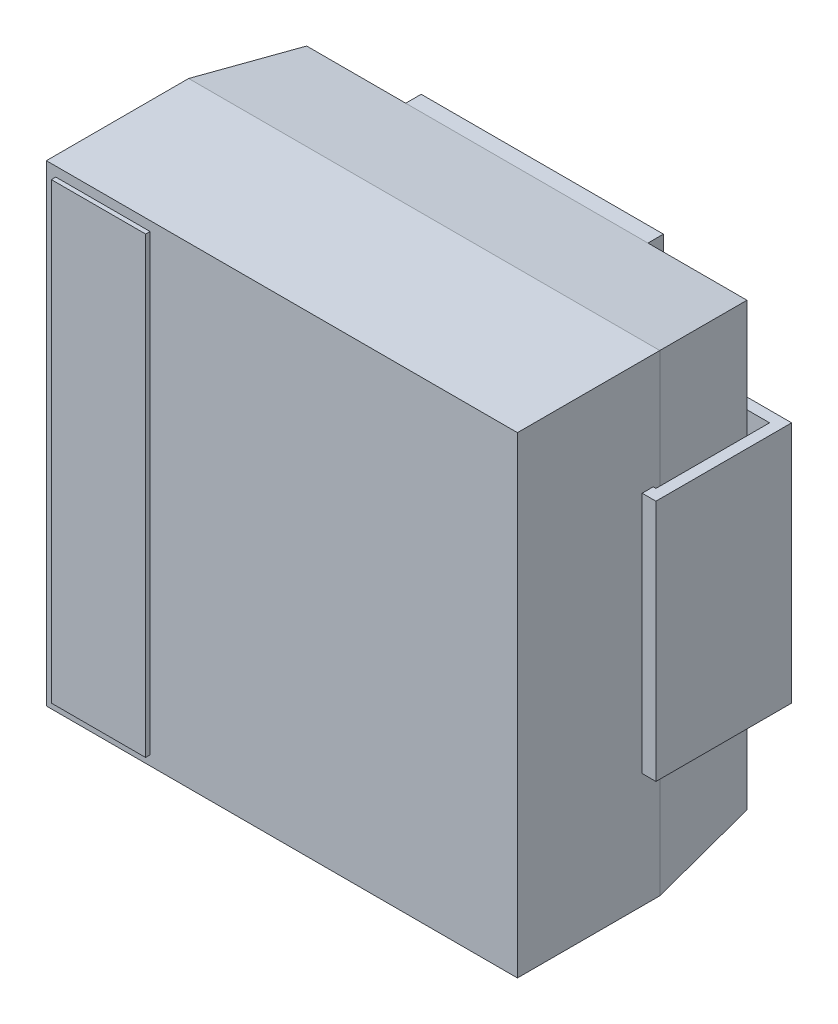
ISO-10303-21;
HEADER;
FILE_DESCRIPTION(('STEP AP214'),'2;1');
FILE_NAME('part.step','',(''),(''),'','','');
FILE_SCHEMA(('AUTOMOTIVE_DESIGN { 1 0 10303 214 1 1 1 1 }'));
ENDSEC;
DATA;
#1=APPLICATION_CONTEXT('core data for automotive mechanical design processes');
#2=APPLICATION_PROTOCOL_DEFINITION('international standard','automotive_design',2000,#1);
#3=PRODUCT_CONTEXT('',#1,'mechanical');
#4=PRODUCT('Part','Part','',(#3));
#5=PRODUCT_RELATED_PRODUCT_CATEGORY('part','',(#4));
#6=PRODUCT_DEFINITION_FORMATION('','',#4);
#7=PRODUCT_DEFINITION_CONTEXT('part definition',#1,'design');
#8=PRODUCT_DEFINITION('design','',#6,#7);
#9=PRODUCT_DEFINITION_SHAPE('','',#8);
#10=(LENGTH_UNIT() NAMED_UNIT(*) SI_UNIT(.MILLI.,.METRE.));
#11=(NAMED_UNIT(*) PLANE_ANGLE_UNIT() SI_UNIT($,.RADIAN.));
#12=(NAMED_UNIT(*) SI_UNIT($,.STERADIAN.) SOLID_ANGLE_UNIT());
#13=UNCERTAINTY_MEASURE_WITH_UNIT(LENGTH_MEASURE(1.E-05),#10,'distance_accuracy_value','');
#14=(GEOMETRIC_REPRESENTATION_CONTEXT(3) GLOBAL_UNCERTAINTY_ASSIGNED_CONTEXT((#13)) GLOBAL_UNIT_ASSIGNED_CONTEXT((#10,
#11,#12)) REPRESENTATION_CONTEXT('',''));
#15=CARTESIAN_POINT('',(0.,0.,0.));
#16=DIRECTION('',(0.,0.,1.));
#17=DIRECTION('',(1.,0.,0.));
#18=AXIS2_PLACEMENT_3D('',#15,#16,#17);
#19=CARTESIAN_POINT('',(-2.603,-2.609,3.048));
#20=DIRECTION('',(0.,0.,1.));
#21=DIRECTION('',(1.,0.,0.));
#22=AXIS2_PLACEMENT_3D('',#19,#20,#21);
#23=PLANE('',#22);
#24=DIRECTION('',(1.,0.,0.));
#25=VECTOR('',#24,1.);
#26=CARTESIAN_POINT('',(-1.518,2.609,3.048));
#27=LINE('',#26,#25);
#28=CARTESIAN_POINT('',(-2.603,2.609,3.048));
#29=VERTEX_POINT('',#28);
#30=CARTESIAN_POINT('',(-1.518,2.609,3.048));
#31=VERTEX_POINT('',#30);
#32=EDGE_CURVE('P0_E20',#29,#31,#27,.T.);
#33=ORIENTED_EDGE('',*,*,#32,.F.);
#34=DIRECTION('',(0.,1.,0.));
#35=VECTOR('',#34,1.);
#36=CARTESIAN_POINT('',(-2.603,2.609,3.048));
#37=LINE('',#36,#35);
#38=CARTESIAN_POINT('',(-2.603,-2.609,3.048));
#39=VERTEX_POINT('',#38);
#40=EDGE_CURVE('P0_E80',#39,#29,#37,.T.);
#41=ORIENTED_EDGE('',*,*,#40,.F.);
#42=DIRECTION('',(1.,0.,0.));
#43=VECTOR('',#42,1.);
#44=CARTESIAN_POINT('',(-2.603,-2.609,3.048));
#45=LINE('',#44,#43);
#46=CARTESIAN_POINT('',(-1.518,-2.609,3.048));
#47=VERTEX_POINT('',#46);
#48=EDGE_CURVE('P0_E68',#47,#39,#45,.F.);
#49=ORIENTED_EDGE('',*,*,#48,.F.);
#50=DIRECTION('',(0.,1.,0.));
#51=VECTOR('',#50,1.);
#52=CARTESIAN_POINT('',(-1.518,-2.609,3.048));
#53=LINE('',#52,#51);
#54=EDGE_CURVE('P0_E55',#31,#47,#53,.F.);
#55=ORIENTED_EDGE('',*,*,#54,.F.);
#56=EDGE_LOOP('',(#33,#41,#49,#55));
#57=FACE_BOUND('',#56,.T.);
#58=ADVANCED_FACE('P0_F17',(#57),#23,.T.);
#59=CARTESIAN_POINT('',(-1.518,2.609,2.997));
#60=DIRECTION('',(0.,1.,0.));
#61=DIRECTION('',(0.,0.,1.));
#62=AXIS2_PLACEMENT_3D('',#59,#60,#61);
#63=PLANE('',#62);
#64=ORIENTED_EDGE('',*,*,#32,.T.);
#65=DIRECTION('',(0.,0.,-1.));
#66=VECTOR('',#65,1.);
#67=CARTESIAN_POINT('',(-1.518,2.609,2.997));
#68=LINE('',#67,#66);
#69=CARTESIAN_POINT('',(-1.518,2.609,2.997));
#70=VERTEX_POINT('',#69);
#71=EDGE_CURVE('P0_E61',#70,#31,#68,.F.);
#72=ORIENTED_EDGE('',*,*,#71,.F.);
#73=DIRECTION('',(-1.,0.,0.));
#74=VECTOR('',#73,1.);
#75=CARTESIAN_POINT('',(-2.603,2.609,2.997));
#76=LINE('',#75,#74);
#77=CARTESIAN_POINT('',(-2.603,2.609,2.997));
#78=VERTEX_POINT('',#77);
#79=EDGE_CURVE('P0_E83',#78,#70,#76,.F.);
#80=ORIENTED_EDGE('',*,*,#79,.F.);
#81=DIRECTION('',(0.,0.,1.));
#82=VECTOR('',#81,1.);
#83=CARTESIAN_POINT('',(-2.603,2.609,2.997));
#84=LINE('',#83,#82);
#85=EDGE_CURVE('P0_E64',#29,#78,#84,.F.);
#86=ORIENTED_EDGE('',*,*,#85,.F.);
#87=EDGE_LOOP('',(#64,#72,#80,#86));
#88=FACE_BOUND('',#87,.T.);
#89=ADVANCED_FACE('P0_F60',(#88),#63,.T.);
#90=CARTESIAN_POINT('',(-1.518,-2.609,2.997));
#91=DIRECTION('',(1.,0.,0.));
#92=DIRECTION('',(0.,0.,-1.));
#93=AXIS2_PLACEMENT_3D('',#90,#91,#92);
#94=PLANE('',#93);
#95=ORIENTED_EDGE('',*,*,#54,.T.);
#96=DIRECTION('',(0.,0.,-1.));
#97=VECTOR('',#96,1.);
#98=CARTESIAN_POINT('',(-1.518,-2.609,2.997));
#99=LINE('',#98,#97);
#100=CARTESIAN_POINT('',(-1.518,-2.609,2.997));
#101=VERTEX_POINT('',#100);
#102=EDGE_CURVE('P0_E70',#101,#47,#99,.F.);
#103=ORIENTED_EDGE('',*,*,#102,.F.);
#104=DIRECTION('',(0.,1.,0.));
#105=VECTOR('',#104,1.);
#106=CARTESIAN_POINT('',(-1.518,2.609,2.997));
#107=LINE('',#106,#105);
#108=EDGE_CURVE('P0_E74',#70,#101,#107,.F.);
#109=ORIENTED_EDGE('',*,*,#108,.F.);
#110=ORIENTED_EDGE('',*,*,#71,.T.);
#111=EDGE_LOOP('',(#95,#103,#109,#110));
#112=FACE_BOUND('',#111,.T.);
#113=ADVANCED_FACE('P0_F72',(#112),#94,.T.);
#114=CARTESIAN_POINT('',(-2.603,-2.609,2.997));
#115=DIRECTION('',(0.,-1.,0.));
#116=DIRECTION('',(0.,0.,-1.));
#117=AXIS2_PLACEMENT_3D('',#114,#115,#116);
#118=PLANE('',#117);
#119=ORIENTED_EDGE('',*,*,#48,.T.);
#120=DIRECTION('',(0.,0.,1.));
#121=VECTOR('',#120,1.);
#122=CARTESIAN_POINT('',(-2.603,-2.609,2.997));
#123=LINE('',#122,#121);
#124=CARTESIAN_POINT('',(-2.603,-2.609,2.997));
#125=VERTEX_POINT('',#124);
#126=EDGE_CURVE('P0_E35',#125,#39,#123,.T.);
#127=ORIENTED_EDGE('',*,*,#126,.F.);
#128=DIRECTION('',(-1.,0.,0.));
#129=VECTOR('',#128,1.);
#130=CARTESIAN_POINT('',(-2.603,-2.609,2.997));
#131=LINE('',#130,#129);
#132=EDGE_CURVE('P0_E26',#101,#125,#131,.T.);
#133=ORIENTED_EDGE('',*,*,#132,.F.);
#134=ORIENTED_EDGE('',*,*,#102,.T.);
#135=EDGE_LOOP('',(#119,#127,#133,#134));
#136=FACE_BOUND('',#135,.T.);
#137=ADVANCED_FACE('P0_F89',(#136),#118,.T.);
#138=CARTESIAN_POINT('',(-2.603,2.609,2.997));
#139=DIRECTION('',(-1.,0.,0.));
#140=DIRECTION('',(0.,0.,1.));
#141=AXIS2_PLACEMENT_3D('',#138,#139,#140);
#142=PLANE('',#141);
#143=ORIENTED_EDGE('',*,*,#40,.T.);
#144=ORIENTED_EDGE('',*,*,#85,.T.);
#145=DIRECTION('',(0.,1.,0.));
#146=VECTOR('',#145,1.);
#147=CARTESIAN_POINT('',(-2.603,2.609,2.997));
#148=LINE('',#147,#146);
#149=EDGE_CURVE('P0_E11',#125,#78,#148,.T.);
#150=ORIENTED_EDGE('',*,*,#149,.F.);
#151=ORIENTED_EDGE('',*,*,#126,.T.);
#152=EDGE_LOOP('',(#143,#144,#150,#151));
#153=FACE_BOUND('',#152,.T.);
#154=ADVANCED_FACE('P0_F91',(#153),#142,.T.);
#155=CARTESIAN_POINT('',(-2.603,2.609,2.997));
#156=DIRECTION('',(0.,0.,-1.));
#157=DIRECTION('',(-1.,0.,0.));
#158=AXIS2_PLACEMENT_3D('',#155,#156,#157);
#159=PLANE('',#158);
#160=ORIENTED_EDGE('',*,*,#132,.T.);
#161=ORIENTED_EDGE('',*,*,#149,.T.);
#162=ORIENTED_EDGE('',*,*,#79,.T.);
#163=ORIENTED_EDGE('',*,*,#108,.T.);
#164=EDGE_LOOP('',(#160,#161,#162,#163));
#165=FACE_BOUND('',#164,.T.);
#166=ADVANCED_FACE('P0_F88',(#165),#159,.T.);
#167=CLOSED_SHELL('',(#58,#89,#113,#137,#154,#166));
#168=MANIFOLD_SOLID_BREP('P0_B1',#167);
#169=CARTESIAN_POINT('',(1.394,-2.54,0.));
#170=DIRECTION('',(1.,0.,0.));
#171=DIRECTION('',(0.,0.,-1.));
#172=AXIS2_PLACEMENT_3D('',#169,#170,#171);
#173=PLANE('',#172);
#174=DIRECTION('',(0.,1.,0.));
#175=VECTOR('',#174,1.);
#176=CARTESIAN_POINT('',(1.394,2.54,0.178));
#177=LINE('',#176,#175);
#178=CARTESIAN_POINT('',(1.394,-2.54,0.178));
#179=VERTEX_POINT('',#178);
#180=CARTESIAN_POINT('',(1.394,2.54,0.178));
#181=VERTEX_POINT('',#180);
#182=EDGE_CURVE('P1_E120',#179,#181,#177,.T.);
#183=ORIENTED_EDGE('',*,*,#182,.F.);
#184=DIRECTION('',(0.,0.,-1.));
#185=VECTOR('',#184,1.);
#186=CARTESIAN_POINT('',(1.394,-2.54,0.));
#187=LINE('',#186,#185);
#188=CARTESIAN_POINT('',(1.394,-2.54,0.));
#189=VERTEX_POINT('',#188);
#190=EDGE_CURVE('P1_E111',#189,#179,#187,.F.);
#191=ORIENTED_EDGE('',*,*,#190,.F.);
#192=DIRECTION('',(0.,1.,0.));
#193=VECTOR('',#192,1.);
#194=CARTESIAN_POINT('',(1.394,2.54,0.));
#195=LINE('',#194,#193);
#196=CARTESIAN_POINT('',(1.394,2.54,0.));
#197=VERTEX_POINT('',#196);
#198=EDGE_CURVE('P1_E107',#197,#189,#195,.F.);
#199=ORIENTED_EDGE('',*,*,#198,.F.);
#200=DIRECTION('',(0.,0.,-1.));
#201=VECTOR('',#200,1.);
#202=CARTESIAN_POINT('',(1.394,2.54,0.));
#203=LINE('',#202,#201);
#204=EDGE_CURVE('P1_E98',#197,#181,#203,.F.);
#205=ORIENTED_EDGE('',*,*,#204,.T.);
#206=EDGE_LOOP('',(#183,#191,#199,#205));
#207=FACE_BOUND('',#206,.T.);
#208=ADVANCED_FACE('P1_F17',(#207),#173,.T.);
#209=CARTESIAN_POINT('',(-1.394,2.54,0.));
#210=DIRECTION('',(0.,0.,-1.));
#211=DIRECTION('',(-1.,0.,0.));
#212=AXIS2_PLACEMENT_3D('',#209,#210,#211);
#213=PLANE('',#212);
#214=DIRECTION('',(1.,0.,0.));
#215=VECTOR('',#214,1.);
#216=CARTESIAN_POINT('',(-1.394,-2.54,0.));
#217=LINE('',#216,#215);
#218=CARTESIAN_POINT('',(-1.394,-2.54,0.));
#219=VERTEX_POINT('',#218);
#220=EDGE_CURVE('P1_E134',#219,#189,#217,.T.);
#221=ORIENTED_EDGE('',*,*,#220,.F.);
#222=DIRECTION('',(0.,1.,0.));
#223=VECTOR('',#222,1.);
#224=CARTESIAN_POINT('',(-1.394,2.54,0.));
#225=LINE('',#224,#223);
#226=CARTESIAN_POINT('',(-1.394,2.54,0.));
#227=VERTEX_POINT('',#226);
#228=EDGE_CURVE('P1_E114',#227,#219,#225,.F.);
#229=ORIENTED_EDGE('',*,*,#228,.F.);
#230=DIRECTION('',(1.,0.,0.));
#231=VECTOR('',#230,1.);
#232=CARTESIAN_POINT('',(1.394,2.54,0.));
#233=LINE('',#232,#231);
#234=EDGE_CURVE('P1_E103',#197,#227,#233,.F.);
#235=ORIENTED_EDGE('',*,*,#234,.F.);
#236=ORIENTED_EDGE('',*,*,#198,.T.);
#237=EDGE_LOOP('',(#221,#229,#235,#236));
#238=FACE_BOUND('',#237,.T.);
#239=ADVANCED_FACE('P1_F116',(#238),#213,.T.);
#240=CARTESIAN_POINT('',(-1.394,2.54,0.));
#241=DIRECTION('',(-1.,0.,0.));
#242=DIRECTION('',(0.,0.,1.));
#243=AXIS2_PLACEMENT_3D('',#240,#241,#242);
#244=PLANE('',#243);
#245=DIRECTION('',(0.,1.,0.));
#246=VECTOR('',#245,1.);
#247=CARTESIAN_POINT('',(-1.394,2.54,0.178));
#248=LINE('',#247,#246);
#249=CARTESIAN_POINT('',(-1.394,2.54,0.178));
#250=VERTEX_POINT('',#249);
#251=CARTESIAN_POINT('',(-1.394,-2.54,0.178));
#252=VERTEX_POINT('',#251);
#253=EDGE_CURVE('P1_E122',#250,#252,#248,.F.);
#254=ORIENTED_EDGE('',*,*,#253,.F.);
#255=DIRECTION('',(0.,0.,1.));
#256=VECTOR('',#255,1.);
#257=CARTESIAN_POINT('',(-1.394,2.54,0.));
#258=LINE('',#257,#256);
#259=EDGE_CURVE('P1_E119',#227,#250,#258,.T.);
#260=ORIENTED_EDGE('',*,*,#259,.F.);
#261=ORIENTED_EDGE('',*,*,#228,.T.);
#262=DIRECTION('',(0.,0.,-1.));
#263=VECTOR('',#262,1.);
#264=CARTESIAN_POINT('',(-1.394,-2.54,0.));
#265=LINE('',#264,#263);
#266=EDGE_CURVE('P1_E137',#252,#219,#265,.T.);
#267=ORIENTED_EDGE('',*,*,#266,.F.);
#268=EDGE_LOOP('',(#254,#260,#261,#267));
#269=FACE_BOUND('',#268,.T.);
#270=ADVANCED_FACE('P1_F408',(#269),#244,.T.);
#271=CARTESIAN_POINT('',(-1.394,-2.54,0.));
#272=DIRECTION('',(0.,-1.,0.));
#273=DIRECTION('',(0.,0.,-1.));
#274=AXIS2_PLACEMENT_3D('',#271,#272,#273);
#275=PLANE('',#274);
#276=DIRECTION('',(1.,0.,0.));
#277=VECTOR('',#276,1.);
#278=CARTESIAN_POINT('',(-2.534,-2.54,0.178));
#279=LINE('',#278,#277);
#280=EDGE_CURVE('P1_E148',#252,#179,#279,.T.);
#281=ORIENTED_EDGE('',*,*,#280,.F.);
#282=ORIENTED_EDGE('',*,*,#266,.T.);
#283=ORIENTED_EDGE('',*,*,#220,.T.);
#284=ORIENTED_EDGE('',*,*,#190,.T.);
#285=EDGE_LOOP('',(#281,#282,#283,#284));
#286=FACE_BOUND('',#285,.T.);
#287=ADVANCED_FACE('P1_F400',(#286),#275,.T.);
#288=CARTESIAN_POINT('',(1.394,2.54,0.178));
#289=DIRECTION('',(0.,0.,-1.));
#290=DIRECTION('',(-1.,0.,0.));
#291=AXIS2_PLACEMENT_3D('',#288,#289,#290);
#292=PLANE('',#291);
#293=DIRECTION('',(1.,0.,0.));
#294=VECTOR('',#293,1.);
#295=CARTESIAN_POINT('',(-2.534,-2.54,0.178));
#296=LINE('',#295,#294);
#297=CARTESIAN_POINT('',(2.534,-2.54,0.178));
#298=VERTEX_POINT('',#297);
#299=EDGE_CURVE('P1_E151',#179,#298,#296,.T.);
#300=ORIENTED_EDGE('',*,*,#299,.F.);
#301=ORIENTED_EDGE('',*,*,#182,.T.);
#302=DIRECTION('',(-1.,0.,0.));
#303=VECTOR('',#302,1.);
#304=CARTESIAN_POINT('',(1.394,2.54,0.178));
#305=LINE('',#304,#303);
#306=CARTESIAN_POINT('',(2.534,2.54,0.178));
#307=VERTEX_POINT('',#306);
#308=EDGE_CURVE('P1_E92',#181,#307,#305,.F.);
#309=ORIENTED_EDGE('',*,*,#308,.T.);
#310=DIRECTION('',(0.,1.,0.));
#311=VECTOR('',#310,1.);
#312=CARTESIAN_POINT('',(2.534,-2.54,0.178));
#313=LINE('',#312,#311);
#314=EDGE_CURVE('P1_E162',#298,#307,#313,.T.);
#315=ORIENTED_EDGE('',*,*,#314,.F.);
#316=EDGE_LOOP('',(#300,#301,#309,#315));
#317=FACE_BOUND('',#316,.T.);
#318=ADVANCED_FACE('P1_F394',(#317),#292,.T.);
#319=CARTESIAN_POINT('',(1.394,2.54,0.));
#320=DIRECTION('',(0.,1.,0.));
#321=DIRECTION('',(0.,0.,1.));
#322=AXIS2_PLACEMENT_3D('',#319,#320,#321);
#323=PLANE('',#322);
#324=DIRECTION('',(1.,0.,0.));
#325=VECTOR('',#324,1.);
#326=CARTESIAN_POINT('',(2.534,2.54,0.178));
#327=LINE('',#326,#325);
#328=EDGE_CURVE('P1_E104',#181,#250,#327,.F.);
#329=ORIENTED_EDGE('',*,*,#328,.F.);
#330=ORIENTED_EDGE('',*,*,#204,.F.);
#331=ORIENTED_EDGE('',*,*,#234,.T.);
#332=ORIENTED_EDGE('',*,*,#259,.T.);
#333=EDGE_LOOP('',(#329,#330,#331,#332));
#334=FACE_BOUND('',#333,.T.);
#335=ADVANCED_FACE('P1_F100',(#334),#323,.T.);
#336=CARTESIAN_POINT('',(-2.534,2.54,0.178));
#337=DIRECTION('',(0.,0.,-1.));
#338=DIRECTION('',(-1.,0.,0.));
#339=AXIS2_PLACEMENT_3D('',#336,#337,#338);
#340=PLANE('',#339);
#341=DIRECTION('',(1.,0.,0.));
#342=VECTOR('',#341,1.);
#343=CARTESIAN_POINT('',(-2.534,-2.54,0.178));
#344=LINE('',#343,#342);
#345=CARTESIAN_POINT('',(-2.534,-2.54,0.178));
#346=VERTEX_POINT('',#345);
#347=EDGE_CURVE('P1_E152',#346,#252,#344,.T.);
#348=ORIENTED_EDGE('',*,*,#347,.F.);
#349=DIRECTION('',(0.,1.,0.));
#350=VECTOR('',#349,1.);
#351=CARTESIAN_POINT('',(-2.534,2.54,0.178));
#352=LINE('',#351,#350);
#353=CARTESIAN_POINT('',(-2.534,2.54,0.178));
#354=VERTEX_POINT('',#353);
#355=EDGE_CURVE('P1_E249',#354,#346,#352,.F.);
#356=ORIENTED_EDGE('',*,*,#355,.F.);
#357=DIRECTION('',(1.,0.,0.));
#358=VECTOR('',#357,1.);
#359=CARTESIAN_POINT('',(2.534,2.54,0.178));
#360=LINE('',#359,#358);
#361=EDGE_CURVE('P1_E239',#250,#354,#360,.F.);
#362=ORIENTED_EDGE('',*,*,#361,.F.);
#363=ORIENTED_EDGE('',*,*,#253,.T.);
#364=EDGE_LOOP('',(#348,#356,#362,#363));
#365=FACE_BOUND('',#364,.T.);
#366=ADVANCED_FACE('P1_F179',(#365),#340,.T.);
#367=CARTESIAN_POINT('',(-2.534,-2.54,0.178));
#368=DIRECTION('',(0.,-0.988840809443446,-0.148976016792067));
#369=DIRECTION('',(0.,0.148976016792067,-0.988840809443446));
#370=AXIS2_PLACEMENT_3D('',#367,#368,#369);
#371=PLANE('',#370);
#372=CARTESIAN_POINT('',(-2.711,-2.718,1.359));
#373=DIRECTION('',(1.,0.,0.));
#374=VECTOR('',#373,1.);
#375=LINE('',#372,#374);
#376=CARTESIAN_POINT('',(-2.71145288339213,-2.71797549116697,1.35893546227573));
#377=VERTEX_POINT('',#376);
#378=CARTESIAN_POINT('',(2.71145288339214,-2.71797549116697,1.35893546227573));
#379=VERTEX_POINT('',#378);
#380=EDGE_CURVE('P1_E276',#377,#379,#375,.T.);
#381=ORIENTED_EDGE('',*,*,#380,.F.);
#382=CARTESIAN_POINT('',(-2.534,-2.54,0.178));
#383=DIRECTION('',(-0.147348161928262,-0.147426320748634,0.978035786219954));
#384=VECTOR('',#383,1.);
#385=LINE('',#382,#384);
#386=EDGE_CURVE('P1_E252',#346,#377,#385,.T.);
#387=ORIENTED_EDGE('',*,*,#386,.F.);
#388=ORIENTED_EDGE('',*,*,#347,.T.);
#389=ORIENTED_EDGE('',*,*,#280,.T.);
#390=ORIENTED_EDGE('',*,*,#299,.T.);
#391=CARTESIAN_POINT('',(2.7119056323867,-2.718,1.35886355993365));
#392=DIRECTION('',(-0.147348161928262,0.147426320748633,-0.978035786219954));
#393=VECTOR('',#392,1.);
#394=LINE('',#391,#393);
#395=EDGE_CURVE('P1_E468',#379,#298,#394,.T.);
#396=ORIENTED_EDGE('',*,*,#395,.F.);
#397=EDGE_LOOP('',(#381,#387,#388,#389,#390,#396));
#398=FACE_BOUND('',#397,.T.);
#399=ADVANCED_FACE('P1_F168',(#398),#371,.T.);
#400=CARTESIAN_POINT('',(2.534,-2.54,0.178));
#401=DIRECTION('',(0.988840809443446,0.,-0.148976016792067));
#402=DIRECTION('',(-0.148976016792067,0.,-0.988840809443446));
#403=AXIS2_PLACEMENT_3D('',#400,#401,#402);
#404=PLANE('',#403);
#405=CARTESIAN_POINT('',(2.711,-2.718,1.359));
#406=DIRECTION('',(0.,1.,0.));
#407=VECTOR('',#406,1.);
#408=LINE('',#405,#407);
#409=CARTESIAN_POINT('',(2.71145147869005,2.71796742764371,1.35893688873233));
#410=VERTEX_POINT('',#409);
#411=EDGE_CURVE('P1_E329',#379,#410,#408,.T.);
#412=ORIENTED_EDGE('',*,*,#411,.F.);
#413=ORIENTED_EDGE('',*,*,#395,.T.);
#414=ORIENTED_EDGE('',*,*,#314,.T.);
#415=CARTESIAN_POINT('',(2.711,2.71792782624028,1.35901087349868));
#416=DIRECTION('',(-0.146598041084075,-0.147366501588549,-0.97815751725367));
#417=VECTOR('',#416,1.);
#418=LINE('',#415,#417);
#419=EDGE_CURVE('P1_E209',#410,#307,#418,.T.);
#420=ORIENTED_EDGE('',*,*,#419,.F.);
#421=EDGE_LOOP('',(#412,#413,#414,#420));
#422=FACE_BOUND('',#421,.T.);
#423=ADVANCED_FACE('P1_F178',(#422),#404,.T.);
#424=CARTESIAN_POINT('',(2.534,2.54,0.178));
#425=DIRECTION('',(0.,0.988840809443446,-0.148976016792067));
#426=DIRECTION('',(0.,0.148976016792067,0.988840809443446));
#427=AXIS2_PLACEMENT_3D('',#424,#425,#426);
#428=PLANE('',#427);
#429=CARTESIAN_POINT('',(2.711,2.718,1.359));
#430=DIRECTION('',(-1.,0.,0.));
#431=VECTOR('',#430,1.);
#432=LINE('',#429,#431);
#433=CARTESIAN_POINT('',(-2.71145288339214,2.71797549116697,1.35893546227573));
#434=VERTEX_POINT('',#433);
#435=EDGE_CURVE('P1_E323',#410,#434,#432,.T.);
#436=ORIENTED_EDGE('',*,*,#435,.F.);
#437=ORIENTED_EDGE('',*,*,#419,.T.);
#438=ORIENTED_EDGE('',*,*,#308,.F.);
#439=ORIENTED_EDGE('',*,*,#328,.T.);
#440=ORIENTED_EDGE('',*,*,#361,.T.);
#441=CARTESIAN_POINT('',(-2.7119056323867,2.718,1.35886355993365));
#442=DIRECTION('',(0.147348161928262,-0.147426320748633,-0.978035786219954));
#443=VECTOR('',#442,1.);
#444=LINE('',#441,#443);
#445=EDGE_CURVE('P1_E270',#434,#354,#444,.T.);
#446=ORIENTED_EDGE('',*,*,#445,.F.);
#447=EDGE_LOOP('',(#436,#437,#438,#439,#440,#446));
#448=FACE_BOUND('',#447,.T.);
#449=ADVANCED_FACE('P1_F214',(#448),#428,.T.);
#450=CARTESIAN_POINT('',(-2.534,2.54,0.178));
#451=DIRECTION('',(-0.988840809443446,0.,-0.148976016792067));
#452=DIRECTION('',(-0.148976016792067,0.,0.988840809443446));
#453=AXIS2_PLACEMENT_3D('',#450,#451,#452);
#454=PLANE('',#453);
#455=CARTESIAN_POINT('',(-2.711,2.718,1.359));
#456=DIRECTION('',(0.,-1.,0.));
#457=VECTOR('',#456,1.);
#458=LINE('',#455,#457);
#459=EDGE_CURVE('P1_E268',#434,#377,#458,.T.);
#460=ORIENTED_EDGE('',*,*,#459,.F.);
#461=ORIENTED_EDGE('',*,*,#445,.T.);
#462=ORIENTED_EDGE('',*,*,#355,.T.);
#463=ORIENTED_EDGE('',*,*,#386,.T.);
#464=EDGE_LOOP('',(#460,#461,#462,#463));
#465=FACE_BOUND('',#464,.T.);
#466=ADVANCED_FACE('P1_F223',(#465),#454,.T.);
#467=CARTESIAN_POINT('',(-2.711,-2.718,1.359));
#468=DIRECTION('',(0.,-1.,0.));
#469=DIRECTION('',(0.,0.,-1.));
#470=AXIS2_PLACEMENT_3D('',#467,#468,#469);
#471=PLANE('',#470);
#472=DIRECTION('',(1.,0.,0.));
#473=VECTOR('',#472,1.);
#474=CARTESIAN_POINT('',(-2.711,-2.718,2.997));
#475=LINE('',#474,#473);
#476=CARTESIAN_POINT('',(-2.711,-2.718,2.997));
#477=VERTEX_POINT('',#476);
#478=CARTESIAN_POINT('',(2.711,-2.718,2.997));
#479=VERTEX_POINT('',#478);
#480=EDGE_CURVE('P1_E280',#477,#479,#475,.T.);
#481=ORIENTED_EDGE('',*,*,#480,.F.);
#482=DIRECTION('',(0.,0.,1.));
#483=VECTOR('',#482,1.);
#484=CARTESIAN_POINT('',(-2.711,-2.718,1.359));
#485=LINE('',#484,#483);
#486=EDGE_CURVE('P1_E274',#377,#477,#485,.T.);
#487=ORIENTED_EDGE('',*,*,#486,.F.);
#488=ORIENTED_EDGE('',*,*,#380,.T.);
#489=DIRECTION('',(0.,0.,-1.));
#490=VECTOR('',#489,1.);
#491=CARTESIAN_POINT('',(2.711,-2.718,1.359));
#492=LINE('',#491,#490);
#493=EDGE_CURVE('P1_E326',#479,#379,#492,.T.);
#494=ORIENTED_EDGE('',*,*,#493,.F.);
#495=EDGE_LOOP('',(#481,#487,#488,#494));
#496=FACE_BOUND('',#495,.T.);
#497=ADVANCED_FACE('P1_F275',(#496),#471,.T.);
#498=CARTESIAN_POINT('',(2.711,-2.718,1.359));
#499=DIRECTION('',(1.,0.,0.));
#500=DIRECTION('',(0.,0.,-1.));
#501=AXIS2_PLACEMENT_3D('',#498,#499,#500);
#502=PLANE('',#501);
#503=DIRECTION('',(0.,1.,0.));
#504=VECTOR('',#503,1.);
#505=CARTESIAN_POINT('',(2.711,-2.718,2.997));
#506=LINE('',#505,#504);
#507=CARTESIAN_POINT('',(2.711,2.718,2.997));
#508=VERTEX_POINT('',#507);
#509=EDGE_CURVE('P1_E338',#479,#508,#506,.T.);
#510=ORIENTED_EDGE('',*,*,#509,.F.);
#511=ORIENTED_EDGE('',*,*,#493,.T.);
#512=ORIENTED_EDGE('',*,*,#411,.T.);
#513=DIRECTION('',(0.,0.,1.));
#514=VECTOR('',#513,1.);
#515=CARTESIAN_POINT('',(2.711,2.718,1.359));
#516=LINE('',#515,#514);
#517=EDGE_CURVE('P1_E285',#508,#410,#516,.F.);
#518=ORIENTED_EDGE('',*,*,#517,.F.);
#519=EDGE_LOOP('',(#510,#511,#512,#518));
#520=FACE_BOUND('',#519,.T.);
#521=ADVANCED_FACE('P1_F308',(#520),#502,.T.);
#522=CARTESIAN_POINT('',(2.711,2.718,1.359));
#523=DIRECTION('',(0.,1.,0.));
#524=DIRECTION('',(0.,0.,1.));
#525=AXIS2_PLACEMENT_3D('',#522,#523,#524);
#526=PLANE('',#525);
#527=DIRECTION('',(1.,0.,0.));
#528=VECTOR('',#527,1.);
#529=CARTESIAN_POINT('',(-2.711,2.718,2.997));
#530=LINE('',#529,#528);
#531=CARTESIAN_POINT('',(-2.711,2.718,2.997));
#532=VERTEX_POINT('',#531);
#533=EDGE_CURVE('P1_E26',#508,#532,#530,.F.);
#534=ORIENTED_EDGE('',*,*,#533,.F.);
#535=ORIENTED_EDGE('',*,*,#517,.T.);
#536=ORIENTED_EDGE('',*,*,#435,.T.);
#537=DIRECTION('',(0.,0.,1.));
#538=VECTOR('',#537,1.);
#539=CARTESIAN_POINT('',(-2.711,2.718,1.359));
#540=LINE('',#539,#538);
#541=EDGE_CURVE('P1_E35',#532,#434,#540,.F.);
#542=ORIENTED_EDGE('',*,*,#541,.F.);
#543=EDGE_LOOP('',(#534,#535,#536,#542));
#544=FACE_BOUND('',#543,.T.);
#545=ADVANCED_FACE('P1_F304',(#544),#526,.T.);
#546=CARTESIAN_POINT('',(-2.711,2.718,1.359));
#547=DIRECTION('',(-1.,0.,0.));
#548=DIRECTION('',(0.,0.,1.));
#549=AXIS2_PLACEMENT_3D('',#546,#547,#548);
#550=PLANE('',#549);
#551=DIRECTION('',(0.,1.,0.));
#552=VECTOR('',#551,1.);
#553=CARTESIAN_POINT('',(-2.711,-2.718,2.997));
#554=LINE('',#553,#552);
#555=EDGE_CURVE('P1_E11',#532,#477,#554,.F.);
#556=ORIENTED_EDGE('',*,*,#555,.F.);
#557=ORIENTED_EDGE('',*,*,#541,.T.);
#558=ORIENTED_EDGE('',*,*,#459,.T.);
#559=ORIENTED_EDGE('',*,*,#486,.T.);
#560=EDGE_LOOP('',(#556,#557,#558,#559));
#561=FACE_BOUND('',#560,.T.);
#562=ADVANCED_FACE('P1_F284',(#561),#550,.T.);
#563=CARTESIAN_POINT('',(-2.711,-2.718,2.997));
#564=DIRECTION('',(0.,0.,1.));
#565=DIRECTION('',(1.,0.,0.));
#566=AXIS2_PLACEMENT_3D('',#563,#564,#565);
#567=PLANE('',#566);
#568=ORIENTED_EDGE('',*,*,#533,.T.);
#569=ORIENTED_EDGE('',*,*,#555,.T.);
#570=ORIENTED_EDGE('',*,*,#480,.T.);
#571=ORIENTED_EDGE('',*,*,#509,.T.);
#572=EDGE_LOOP('',(#568,#569,#570,#571));
#573=FACE_BOUND('',#572,.T.);
#574=ADVANCED_FACE('P1_F303',(#573),#567,.T.);
#575=CLOSED_SHELL('',(#208,#239,#270,#287,#318,#335,#366,#399,#423,#449,#466,#497,#521,#545,
#562,#574));
#576=MANIFOLD_SOLID_BREP('P1_B1',#575);
#577=CARTESIAN_POINT('',(-2.743,-1.397,0.127));
#578=DIRECTION('',(1.,0.,0.));
#579=DIRECTION('',(0.,0.,-1.));
#580=AXIS2_PLACEMENT_3D('',#577,#578,#579);
#581=PLANE('',#580);
#582=DIRECTION('',(0.,1.,0.));
#583=VECTOR('',#582,1.);
#584=CARTESIAN_POINT('',(-2.743,1.397,1.435));
#585=LINE('',#584,#583);
#586=CARTESIAN_POINT('',(-2.743,-1.397,1.435));
#587=VERTEX_POINT('',#586);
#588=CARTESIAN_POINT('',(-2.743,1.397,1.435));
#589=VERTEX_POINT('',#588);
#590=EDGE_CURVE('P2_E100',#587,#589,#585,.T.);
#591=ORIENTED_EDGE('',*,*,#590,.F.);
#592=DIRECTION('',(0.,0.,-1.));
#593=VECTOR('',#592,1.);
#594=CARTESIAN_POINT('',(-2.743,-1.397,0.127));
#595=LINE('',#594,#593);
#596=CARTESIAN_POINT('',(-2.743,-1.397,0.127));
#597=VERTEX_POINT('',#596);
#598=EDGE_CURVE('P2_E86',#587,#597,#595,.T.);
#599=ORIENTED_EDGE('',*,*,#598,.T.);
#600=DIRECTION('',(0.,1.,0.));
#601=VECTOR('',#600,1.);
#602=CARTESIAN_POINT('',(-2.743,-1.397,0.127));
#603=LINE('',#602,#601);
#604=CARTESIAN_POINT('',(-2.743,1.397,0.127));
#605=VERTEX_POINT('',#604);
#606=EDGE_CURVE('P2_E97',#605,#597,#603,.F.);
#607=ORIENTED_EDGE('',*,*,#606,.F.);
#608=DIRECTION('',(0.,0.,-1.));
#609=VECTOR('',#608,1.);
#610=CARTESIAN_POINT('',(-2.743,1.397,0.127));
#611=LINE('',#610,#609);
#612=EDGE_CURVE('P2_E20',#605,#589,#611,.F.);
#613=ORIENTED_EDGE('',*,*,#612,.T.);
#614=EDGE_LOOP('',(#591,#599,#607,#613));
#615=FACE_BOUND('',#614,.T.);
#616=ADVANCED_FACE('P2_F17',(#615),#581,.T.);
#617=CARTESIAN_POINT('',(-2.743,-1.397,0.127));
#618=DIRECTION('',(0.,0.,1.));
#619=DIRECTION('',(1.,0.,0.));
#620=AXIS2_PLACEMENT_3D('',#617,#618,#619);
#621=PLANE('',#620);
#622=DIRECTION('',(1.,0.,0.));
#623=VECTOR('',#622,1.);
#624=CARTESIAN_POINT('',(-2.743,1.397,0.127));
#625=LINE('',#624,#623);
#626=CARTESIAN_POINT('',(-1.549,1.397,0.127));
#627=VERTEX_POINT('',#626);
#628=EDGE_CURVE('P2_E94',#627,#605,#625,.F.);
#629=ORIENTED_EDGE('',*,*,#628,.T.);
#630=ORIENTED_EDGE('',*,*,#606,.T.);
#631=DIRECTION('',(1.,0.,0.));
#632=VECTOR('',#631,1.);
#633=CARTESIAN_POINT('',(-2.743,-1.397,0.127));
#634=LINE('',#633,#632);
#635=CARTESIAN_POINT('',(-1.549,-1.397,0.127));
#636=VERTEX_POINT('',#635);
#637=EDGE_CURVE('P2_E83',#597,#636,#634,.T.);
#638=ORIENTED_EDGE('',*,*,#637,.T.);
#639=DIRECTION('',(0.,1.,0.));
#640=VECTOR('',#639,1.);
#641=CARTESIAN_POINT('',(-1.549,-1.397,0.127));
#642=LINE('',#641,#640);
#643=EDGE_CURVE('P2_E114',#627,#636,#642,.F.);
#644=ORIENTED_EDGE('',*,*,#643,.F.);
#645=EDGE_LOOP('',(#629,#630,#638,#644));
#646=FACE_BOUND('',#645,.T.);
#647=ADVANCED_FACE('P2_F102',(#646),#621,.T.);
#648=CARTESIAN_POINT('',(-2.743,1.397,1.435));
#649=DIRECTION('',(0.,0.,-1.));
#650=DIRECTION('',(-1.,0.,0.));
#651=AXIS2_PLACEMENT_3D('',#648,#649,#650);
#652=PLANE('',#651);
#653=DIRECTION('',(-1.,0.,0.));
#654=VECTOR('',#653,1.);
#655=CARTESIAN_POINT('',(-2.743,-1.397,1.435));
#656=LINE('',#655,#654);
#657=CARTESIAN_POINT('',(-2.711,-1.397,1.435));
#658=VERTEX_POINT('',#657);
#659=EDGE_CURVE('P2_E105',#658,#587,#656,.T.);
#660=ORIENTED_EDGE('',*,*,#659,.T.);
#661=ORIENTED_EDGE('',*,*,#590,.T.);
#662=DIRECTION('',(-1.,0.,0.));
#663=VECTOR('',#662,1.);
#664=CARTESIAN_POINT('',(-2.743,1.397,1.435));
#665=LINE('',#664,#663);
#666=CARTESIAN_POINT('',(-2.711,1.397,1.435));
#667=VERTEX_POINT('',#666);
#668=EDGE_CURVE('P2_E103',#589,#667,#665,.F.);
#669=ORIENTED_EDGE('',*,*,#668,.T.);
#670=DIRECTION('',(0.,1.,0.));
#671=VECTOR('',#670,1.);
#672=CARTESIAN_POINT('',(-2.711,-1.397,1.435));
#673=LINE('',#672,#671);
#674=EDGE_CURVE('P2_E117',#658,#667,#673,.T.);
#675=ORIENTED_EDGE('',*,*,#674,.F.);
#676=EDGE_LOOP('',(#660,#661,#669,#675));
#677=FACE_BOUND('',#676,.T.);
#678=ADVANCED_FACE('P2_F163',(#677),#652,.T.);
#679=CARTESIAN_POINT('',(-1.549,-1.397,0.));
#680=DIRECTION('',(1.,0.,0.));
#681=DIRECTION('',(0.,0.,-1.));
#682=AXIS2_PLACEMENT_3D('',#679,#680,#681);
#683=PLANE('',#682);
#684=ORIENTED_EDGE('',*,*,#643,.T.);
#685=DIRECTION('',(0.,0.,-1.));
#686=VECTOR('',#685,1.);
#687=CARTESIAN_POINT('',(-1.549,-1.397,0.));
#688=LINE('',#687,#686);
#689=CARTESIAN_POINT('',(-1.549,-1.397,0.));
#690=VERTEX_POINT('',#689);
#691=EDGE_CURVE('P2_E89',#636,#690,#688,.T.);
#692=ORIENTED_EDGE('',*,*,#691,.T.);
#693=DIRECTION('',(0.,1.,0.));
#694=VECTOR('',#693,1.);
#695=CARTESIAN_POINT('',(-1.549,1.397,0.));
#696=LINE('',#695,#694);
#697=CARTESIAN_POINT('',(-1.549,1.397,0.));
#698=VERTEX_POINT('',#697);
#699=EDGE_CURVE('P2_E122',#698,#690,#696,.F.);
#700=ORIENTED_EDGE('',*,*,#699,.F.);
#701=DIRECTION('',(0.,0.,-1.));
#702=VECTOR('',#701,1.);
#703=CARTESIAN_POINT('',(-1.549,1.397,0.));
#704=LINE('',#703,#702);
#705=EDGE_CURVE('P2_E111',#698,#627,#704,.F.);
#706=ORIENTED_EDGE('',*,*,#705,.T.);
#707=EDGE_LOOP('',(#684,#692,#700,#706));
#708=FACE_BOUND('',#707,.T.);
#709=ADVANCED_FACE('P2_F161',(#708),#683,.T.);
#710=CARTESIAN_POINT('',(-2.711,-1.397,1.435));
#711=DIRECTION('',(1.,0.,0.));
#712=DIRECTION('',(0.,0.,-1.));
#713=AXIS2_PLACEMENT_3D('',#710,#711,#712);
#714=PLANE('',#713);
#715=DIRECTION('',(0.,1.,0.));
#716=VECTOR('',#715,1.);
#717=CARTESIAN_POINT('',(-2.711,-1.397,1.562));
#718=LINE('',#717,#716);
#719=CARTESIAN_POINT('',(-2.711,-1.397,1.562));
#720=VERTEX_POINT('',#719);
#721=CARTESIAN_POINT('',(-2.711,1.397,1.562));
#722=VERTEX_POINT('',#721);
#723=EDGE_CURVE('P2_E132',#720,#722,#718,.T.);
#724=ORIENTED_EDGE('',*,*,#723,.F.);
#725=DIRECTION('',(0.,0.,-1.));
#726=VECTOR('',#725,1.);
#727=CARTESIAN_POINT('',(-2.711,-1.397,0.));
#728=LINE('',#727,#726);
#729=EDGE_CURVE('P2_E127',#658,#720,#728,.F.);
#730=ORIENTED_EDGE('',*,*,#729,.F.);
#731=ORIENTED_EDGE('',*,*,#674,.T.);
#732=DIRECTION('',(0.,0.,-1.));
#733=VECTOR('',#732,1.);
#734=CARTESIAN_POINT('',(-2.711,1.397,1.435));
#735=LINE('',#734,#733);
#736=EDGE_CURVE('P2_E120',#667,#722,#735,.F.);
#737=ORIENTED_EDGE('',*,*,#736,.T.);
#738=EDGE_LOOP('',(#724,#730,#731,#737));
#739=FACE_BOUND('',#738,.T.);
#740=ADVANCED_FACE('P2_F153',(#739),#714,.T.);
#741=CARTESIAN_POINT('',(-2.87,1.397,0.));
#742=DIRECTION('',(0.,0.,-1.));
#743=DIRECTION('',(-1.,0.,0.));
#744=AXIS2_PLACEMENT_3D('',#741,#742,#743);
#745=PLANE('',#744);
#746=DIRECTION('',(1.,0.,0.));
#747=VECTOR('',#746,1.);
#748=CARTESIAN_POINT('',(-2.87,-1.397,0.));
#749=LINE('',#748,#747);
#750=CARTESIAN_POINT('',(-2.87,-1.397,0.));
#751=VERTEX_POINT('',#750);
#752=EDGE_CURVE('P2_E125',#751,#690,#749,.T.);
#753=ORIENTED_EDGE('',*,*,#752,.F.);
#754=DIRECTION('',(0.,1.,0.));
#755=VECTOR('',#754,1.);
#756=CARTESIAN_POINT('',(-2.87,1.397,0.));
#757=LINE('',#756,#755);
#758=CARTESIAN_POINT('',(-2.87,1.397,0.));
#759=VERTEX_POINT('',#758);
#760=EDGE_CURVE('P2_E138',#759,#751,#757,.F.);
#761=ORIENTED_EDGE('',*,*,#760,.F.);
#762=DIRECTION('',(1.,0.,0.));
#763=VECTOR('',#762,1.);
#764=CARTESIAN_POINT('',(-1.549,1.397,0.));
#765=LINE('',#764,#763);
#766=EDGE_CURVE('P2_E134',#698,#759,#765,.F.);
#767=ORIENTED_EDGE('',*,*,#766,.F.);
#768=ORIENTED_EDGE('',*,*,#699,.T.);
#769=EDGE_LOOP('',(#753,#761,#767,#768));
#770=FACE_BOUND('',#769,.T.);
#771=ADVANCED_FACE('P2_F159',(#770),#745,.T.);
#772=CARTESIAN_POINT('',(-2.87,-1.397,0.));
#773=DIRECTION('',(0.,-1.,0.));
#774=DIRECTION('',(0.,0.,-1.));
#775=AXIS2_PLACEMENT_3D('',#772,#773,#774);
#776=PLANE('',#775);
#777=DIRECTION('',(1.,0.,0.));
#778=VECTOR('',#777,1.);
#779=CARTESIAN_POINT('',(-2.87,-1.397,1.562));
#780=LINE('',#779,#778);
#781=CARTESIAN_POINT('',(-2.87,-1.397,1.562));
#782=VERTEX_POINT('',#781);
#783=EDGE_CURVE('P2_E129',#782,#720,#780,.T.);
#784=ORIENTED_EDGE('',*,*,#783,.F.);
#785=DIRECTION('',(0.,0.,1.));
#786=VECTOR('',#785,1.);
#787=CARTESIAN_POINT('',(-2.87,-1.397,0.));
#788=LINE('',#787,#786);
#789=EDGE_CURVE('P2_E141',#751,#782,#788,.T.);
#790=ORIENTED_EDGE('',*,*,#789,.F.);
#791=ORIENTED_EDGE('',*,*,#752,.T.);
#792=ORIENTED_EDGE('',*,*,#691,.F.);
#793=ORIENTED_EDGE('',*,*,#637,.F.);
#794=ORIENTED_EDGE('',*,*,#598,.F.);
#795=ORIENTED_EDGE('',*,*,#659,.F.);
#796=ORIENTED_EDGE('',*,*,#729,.T.);
#797=EDGE_LOOP('',(#784,#790,#791,#792,#793,#794,#795,#796));
#798=FACE_BOUND('',#797,.T.);
#799=ADVANCED_FACE('P2_F85',(#798),#776,.T.);
#800=CARTESIAN_POINT('',(-2.87,-1.397,1.562));
#801=DIRECTION('',(0.,0.,1.));
#802=DIRECTION('',(1.,0.,0.));
#803=AXIS2_PLACEMENT_3D('',#800,#801,#802);
#804=PLANE('',#803);
#805=DIRECTION('',(1.,0.,0.));
#806=VECTOR('',#805,1.);
#807=CARTESIAN_POINT('',(-1.549,1.397,1.562));
#808=LINE('',#807,#806);
#809=CARTESIAN_POINT('',(-2.87,1.397,1.562));
#810=VERTEX_POINT('',#809);
#811=EDGE_CURVE('P2_E35',#810,#722,#808,.T.);
#812=ORIENTED_EDGE('',*,*,#811,.F.);
#813=DIRECTION('',(0.,1.,0.));
#814=VECTOR('',#813,1.);
#815=CARTESIAN_POINT('',(-2.87,1.397,1.562));
#816=LINE('',#815,#814);
#817=EDGE_CURVE('P2_E26',#782,#810,#816,.T.);
#818=ORIENTED_EDGE('',*,*,#817,.F.);
#819=ORIENTED_EDGE('',*,*,#783,.T.);
#820=ORIENTED_EDGE('',*,*,#723,.T.);
#821=EDGE_LOOP('',(#812,#818,#819,#820));
#822=FACE_BOUND('',#821,.T.);
#823=ADVANCED_FACE('P2_F148',(#822),#804,.T.);
#824=CARTESIAN_POINT('',(-1.549,1.397,0.));
#825=DIRECTION('',(0.,1.,0.));
#826=DIRECTION('',(0.,0.,1.));
#827=AXIS2_PLACEMENT_3D('',#824,#825,#826);
#828=PLANE('',#827);
#829=ORIENTED_EDGE('',*,*,#628,.F.);
#830=ORIENTED_EDGE('',*,*,#705,.F.);
#831=ORIENTED_EDGE('',*,*,#766,.T.);
#832=DIRECTION('',(0.,0.,1.));
#833=VECTOR('',#832,1.);
#834=CARTESIAN_POINT('',(-2.87,1.397,0.));
#835=LINE('',#834,#833);
#836=EDGE_CURVE('P2_E11',#810,#759,#835,.F.);
#837=ORIENTED_EDGE('',*,*,#836,.F.);
#838=ORIENTED_EDGE('',*,*,#811,.T.);
#839=ORIENTED_EDGE('',*,*,#736,.F.);
#840=ORIENTED_EDGE('',*,*,#668,.F.);
#841=ORIENTED_EDGE('',*,*,#612,.F.);
#842=EDGE_LOOP('',(#829,#830,#831,#837,#838,#839,#840,#841));
#843=FACE_BOUND('',#842,.T.);
#844=ADVANCED_FACE('P2_F155',(#843),#828,.T.);
#845=CARTESIAN_POINT('',(-2.87,1.397,0.));
#846=DIRECTION('',(-1.,0.,0.));
#847=DIRECTION('',(0.,0.,1.));
#848=AXIS2_PLACEMENT_3D('',#845,#846,#847);
#849=PLANE('',#848);
#850=ORIENTED_EDGE('',*,*,#817,.T.);
#851=ORIENTED_EDGE('',*,*,#836,.T.);
#852=ORIENTED_EDGE('',*,*,#760,.T.);
#853=ORIENTED_EDGE('',*,*,#789,.T.);
#854=EDGE_LOOP('',(#850,#851,#852,#853));
#855=FACE_BOUND('',#854,.T.);
#856=ADVANCED_FACE('P2_F146',(#855),#849,.T.);
#857=CLOSED_SHELL('',(#616,#647,#678,#709,#740,#771,#799,#823,#844,#856));
#858=MANIFOLD_SOLID_BREP('P2_B1',#857);
#859=CARTESIAN_POINT('',(2.743,1.397,0.127));
#860=DIRECTION('',(-1.,0.,0.));
#861=DIRECTION('',(0.,0.,1.));
#862=AXIS2_PLACEMENT_3D('',#859,#860,#861);
#863=PLANE('',#862);
#864=DIRECTION('',(0.,1.,0.));
#865=VECTOR('',#864,1.);
#866=CARTESIAN_POINT('',(2.743,-1.397,1.435));
#867=LINE('',#866,#865);
#868=CARTESIAN_POINT('',(2.743,1.397,1.435));
#869=VERTEX_POINT('',#868);
#870=CARTESIAN_POINT('',(2.743,-1.397,1.435));
#871=VERTEX_POINT('',#870);
#872=EDGE_CURVE('P3_E100',#869,#871,#867,.F.);
#873=ORIENTED_EDGE('',*,*,#872,.F.);
#874=DIRECTION('',(0.,0.,1.));
#875=VECTOR('',#874,1.);
#876=CARTESIAN_POINT('',(2.743,1.397,0.127));
#877=LINE('',#876,#875);
#878=CARTESIAN_POINT('',(2.743,1.397,0.127));
#879=VERTEX_POINT('',#878);
#880=EDGE_CURVE('P3_E86',#869,#879,#877,.F.);
#881=ORIENTED_EDGE('',*,*,#880,.T.);
#882=DIRECTION('',(0.,1.,0.));
#883=VECTOR('',#882,1.);
#884=CARTESIAN_POINT('',(2.743,1.397,0.127));
#885=LINE('',#884,#883);
#886=CARTESIAN_POINT('',(2.743,-1.397,0.127));
#887=VERTEX_POINT('',#886);
#888=EDGE_CURVE('P3_E97',#887,#879,#885,.T.);
#889=ORIENTED_EDGE('',*,*,#888,.F.);
#890=DIRECTION('',(0.,0.,1.));
#891=VECTOR('',#890,1.);
#892=CARTESIAN_POINT('',(2.743,-1.397,0.127));
#893=LINE('',#892,#891);
#894=EDGE_CURVE('P3_E20',#887,#871,#893,.T.);
#895=ORIENTED_EDGE('',*,*,#894,.T.);
#896=EDGE_LOOP('',(#873,#881,#889,#895));
#897=FACE_BOUND('',#896,.T.);
#898=ADVANCED_FACE('P3_F17',(#897),#863,.T.);
#899=CARTESIAN_POINT('',(2.743,1.397,0.127));
#900=DIRECTION('',(0.,0.,1.));
#901=DIRECTION('',(1.,0.,0.));
#902=AXIS2_PLACEMENT_3D('',#899,#900,#901);
#903=PLANE('',#902);
#904=DIRECTION('',(1.,0.,0.));
#905=VECTOR('',#904,1.);
#906=CARTESIAN_POINT('',(2.743,-1.397,0.127));
#907=LINE('',#906,#905);
#908=CARTESIAN_POINT('',(1.549,-1.397,0.127));
#909=VERTEX_POINT('',#908);
#910=EDGE_CURVE('P3_E94',#909,#887,#907,.T.);
#911=ORIENTED_EDGE('',*,*,#910,.T.);
#912=ORIENTED_EDGE('',*,*,#888,.T.);
#913=DIRECTION('',(1.,0.,0.));
#914=VECTOR('',#913,1.);
#915=CARTESIAN_POINT('',(2.743,1.397,0.127));
#916=LINE('',#915,#914);
#917=CARTESIAN_POINT('',(1.549,1.397,0.127));
#918=VERTEX_POINT('',#917);
#919=EDGE_CURVE('P3_E83',#879,#918,#916,.F.);
#920=ORIENTED_EDGE('',*,*,#919,.T.);
#921=DIRECTION('',(0.,1.,0.));
#922=VECTOR('',#921,1.);
#923=CARTESIAN_POINT('',(1.549,1.397,0.127));
#924=LINE('',#923,#922);
#925=EDGE_CURVE('P3_E114',#909,#918,#924,.T.);
#926=ORIENTED_EDGE('',*,*,#925,.F.);
#927=EDGE_LOOP('',(#911,#912,#920,#926));
#928=FACE_BOUND('',#927,.T.);
#929=ADVANCED_FACE('P3_F102',(#928),#903,.T.);
#930=CARTESIAN_POINT('',(2.743,-1.397,1.435));
#931=DIRECTION('',(0.,0.,-1.));
#932=DIRECTION('',(-1.,0.,0.));
#933=AXIS2_PLACEMENT_3D('',#930,#931,#932);
#934=PLANE('',#933);
#935=DIRECTION('',(-1.,0.,0.));
#936=VECTOR('',#935,1.);
#937=CARTESIAN_POINT('',(2.743,1.397,1.435));
#938=LINE('',#937,#936);
#939=CARTESIAN_POINT('',(2.711,1.397,1.435));
#940=VERTEX_POINT('',#939);
#941=EDGE_CURVE('P3_E105',#940,#869,#938,.F.);
#942=ORIENTED_EDGE('',*,*,#941,.T.);
#943=ORIENTED_EDGE('',*,*,#872,.T.);
#944=DIRECTION('',(-1.,0.,0.));
#945=VECTOR('',#944,1.);
#946=CARTESIAN_POINT('',(2.743,-1.397,1.435));
#947=LINE('',#946,#945);
#948=CARTESIAN_POINT('',(2.711,-1.397,1.435));
#949=VERTEX_POINT('',#948);
#950=EDGE_CURVE('P3_E103',#871,#949,#947,.T.);
#951=ORIENTED_EDGE('',*,*,#950,.T.);
#952=DIRECTION('',(0.,1.,0.));
#953=VECTOR('',#952,1.);
#954=CARTESIAN_POINT('',(2.711,1.397,1.435));
#955=LINE('',#954,#953);
#956=EDGE_CURVE('P3_E117',#940,#949,#955,.F.);
#957=ORIENTED_EDGE('',*,*,#956,.F.);
#958=EDGE_LOOP('',(#942,#943,#951,#957));
#959=FACE_BOUND('',#958,.T.);
#960=ADVANCED_FACE('P3_F163',(#959),#934,.T.);
#961=CARTESIAN_POINT('',(1.549,1.397,0.));
#962=DIRECTION('',(-1.,0.,0.));
#963=DIRECTION('',(0.,0.,1.));
#964=AXIS2_PLACEMENT_3D('',#961,#962,#963);
#965=PLANE('',#964);
#966=ORIENTED_EDGE('',*,*,#925,.T.);
#967=DIRECTION('',(0.,0.,1.));
#968=VECTOR('',#967,1.);
#969=CARTESIAN_POINT('',(1.549,1.397,0.));
#970=LINE('',#969,#968);
#971=CARTESIAN_POINT('',(1.549,1.397,0.));
#972=VERTEX_POINT('',#971);
#973=EDGE_CURVE('P3_E89',#918,#972,#970,.F.);
#974=ORIENTED_EDGE('',*,*,#973,.T.);
#975=DIRECTION('',(0.,1.,0.));
#976=VECTOR('',#975,1.);
#977=CARTESIAN_POINT('',(1.549,-1.397,0.));
#978=LINE('',#977,#976);
#979=CARTESIAN_POINT('',(1.549,-1.397,0.));
#980=VERTEX_POINT('',#979);
#981=EDGE_CURVE('P3_E122',#980,#972,#978,.T.);
#982=ORIENTED_EDGE('',*,*,#981,.F.);
#983=DIRECTION('',(0.,0.,1.));
#984=VECTOR('',#983,1.);
#985=CARTESIAN_POINT('',(1.549,-1.397,0.));
#986=LINE('',#985,#984);
#987=EDGE_CURVE('P3_E111',#980,#909,#986,.T.);
#988=ORIENTED_EDGE('',*,*,#987,.T.);
#989=EDGE_LOOP('',(#966,#974,#982,#988));
#990=FACE_BOUND('',#989,.T.);
#991=ADVANCED_FACE('P3_F161',(#990),#965,.T.);
#992=CARTESIAN_POINT('',(2.711,1.397,1.435));
#993=DIRECTION('',(-1.,0.,0.));
#994=DIRECTION('',(0.,0.,1.));
#995=AXIS2_PLACEMENT_3D('',#992,#993,#994);
#996=PLANE('',#995);
#997=DIRECTION('',(0.,1.,0.));
#998=VECTOR('',#997,1.);
#999=CARTESIAN_POINT('',(2.711,1.397,1.562));
#1000=LINE('',#999,#998);
#1001=CARTESIAN_POINT('',(2.711,1.397,1.562));
#1002=VERTEX_POINT('',#1001);
#1003=CARTESIAN_POINT('',(2.711,-1.397,1.562));
#1004=VERTEX_POINT('',#1003);
#1005=EDGE_CURVE('P3_E132',#1002,#1004,#1000,.F.);
#1006=ORIENTED_EDGE('',*,*,#1005,.F.);
#1007=DIRECTION('',(0.,0.,1.));
#1008=VECTOR('',#1007,1.);
#1009=CARTESIAN_POINT('',(2.711,1.397,0.));
#1010=LINE('',#1009,#1008);
#1011=EDGE_CURVE('P3_E127',#940,#1002,#1010,.T.);
#1012=ORIENTED_EDGE('',*,*,#1011,.F.);
#1013=ORIENTED_EDGE('',*,*,#956,.T.);
#1014=DIRECTION('',(0.,0.,1.));
#1015=VECTOR('',#1014,1.);
#1016=CARTESIAN_POINT('',(2.711,-1.397,1.435));
#1017=LINE('',#1016,#1015);
#1018=EDGE_CURVE('P3_E120',#949,#1004,#1017,.T.);
#1019=ORIENTED_EDGE('',*,*,#1018,.T.);
#1020=EDGE_LOOP('',(#1006,#1012,#1013,#1019));
#1021=FACE_BOUND('',#1020,.T.);
#1022=ADVANCED_FACE('P3_F153',(#1021),#996,.T.);
#1023=CARTESIAN_POINT('',(2.87,-1.397,0.));
#1024=DIRECTION('',(0.,0.,-1.));
#1025=DIRECTION('',(-1.,0.,0.));
#1026=AXIS2_PLACEMENT_3D('',#1023,#1024,#1025);
#1027=PLANE('',#1026);
#1028=DIRECTION('',(1.,0.,0.));
#1029=VECTOR('',#1028,1.);
#1030=CARTESIAN_POINT('',(2.87,1.397,0.));
#1031=LINE('',#1030,#1029);
#1032=CARTESIAN_POINT('',(2.87,1.397,0.));
#1033=VERTEX_POINT('',#1032);
#1034=EDGE_CURVE('P3_E125',#1033,#972,#1031,.F.);
#1035=ORIENTED_EDGE('',*,*,#1034,.F.);
#1036=DIRECTION('',(0.,1.,0.));
#1037=VECTOR('',#1036,1.);
#1038=CARTESIAN_POINT('',(2.87,-1.397,0.));
#1039=LINE('',#1038,#1037);
#1040=CARTESIAN_POINT('',(2.87,-1.397,0.));
#1041=VERTEX_POINT('',#1040);
#1042=EDGE_CURVE('P3_E138',#1041,#1033,#1039,.T.);
#1043=ORIENTED_EDGE('',*,*,#1042,.F.);
#1044=DIRECTION('',(1.,0.,0.));
#1045=VECTOR('',#1044,1.);
#1046=CARTESIAN_POINT('',(1.549,-1.397,0.));
#1047=LINE('',#1046,#1045);
#1048=EDGE_CURVE('P3_E134',#980,#1041,#1047,.T.);
#1049=ORIENTED_EDGE('',*,*,#1048,.F.);
#1050=ORIENTED_EDGE('',*,*,#981,.T.);
#1051=EDGE_LOOP('',(#1035,#1043,#1049,#1050));
#1052=FACE_BOUND('',#1051,.T.);
#1053=ADVANCED_FACE('P3_F159',(#1052),#1027,.T.);
#1054=CARTESIAN_POINT('',(2.87,1.397,0.));
#1055=DIRECTION('',(0.,1.,0.));
#1056=DIRECTION('',(0.,0.,1.));
#1057=AXIS2_PLACEMENT_3D('',#1054,#1055,#1056);
#1058=PLANE('',#1057);
#1059=DIRECTION('',(1.,0.,0.));
#1060=VECTOR('',#1059,1.);
#1061=CARTESIAN_POINT('',(2.87,1.397,1.562));
#1062=LINE('',#1061,#1060);
#1063=CARTESIAN_POINT('',(2.87,1.397,1.562));
#1064=VERTEX_POINT('',#1063);
#1065=EDGE_CURVE('P3_E129',#1064,#1002,#1062,.F.);
#1066=ORIENTED_EDGE('',*,*,#1065,.F.);
#1067=DIRECTION('',(0.,0.,-1.));
#1068=VECTOR('',#1067,1.);
#1069=CARTESIAN_POINT('',(2.87,1.397,0.));
#1070=LINE('',#1069,#1068);
#1071=EDGE_CURVE('P3_E141',#1033,#1064,#1070,.F.);
#1072=ORIENTED_EDGE('',*,*,#1071,.F.);
#1073=ORIENTED_EDGE('',*,*,#1034,.T.);
#1074=ORIENTED_EDGE('',*,*,#973,.F.);
#1075=ORIENTED_EDGE('',*,*,#919,.F.);
#1076=ORIENTED_EDGE('',*,*,#880,.F.);
#1077=ORIENTED_EDGE('',*,*,#941,.F.);
#1078=ORIENTED_EDGE('',*,*,#1011,.T.);
#1079=EDGE_LOOP('',(#1066,#1072,#1073,#1074,#1075,#1076,#1077,#1078));
#1080=FACE_BOUND('',#1079,.T.);
#1081=ADVANCED_FACE('P3_F85',(#1080),#1058,.T.);
#1082=CARTESIAN_POINT('',(2.87,1.397,1.562));
#1083=DIRECTION('',(0.,0.,1.));
#1084=DIRECTION('',(1.,0.,0.));
#1085=AXIS2_PLACEMENT_3D('',#1082,#1083,#1084);
#1086=PLANE('',#1085);
#1087=DIRECTION('',(1.,0.,0.));
#1088=VECTOR('',#1087,1.);
#1089=CARTESIAN_POINT('',(1.549,-1.397,1.562));
#1090=LINE('',#1089,#1088);
#1091=CARTESIAN_POINT('',(2.87,-1.397,1.562));
#1092=VERTEX_POINT('',#1091);
#1093=EDGE_CURVE('P3_E35',#1092,#1004,#1090,.F.);
#1094=ORIENTED_EDGE('',*,*,#1093,.F.);
#1095=DIRECTION('',(0.,1.,0.));
#1096=VECTOR('',#1095,1.);
#1097=CARTESIAN_POINT('',(2.87,-1.397,1.562));
#1098=LINE('',#1097,#1096);
#1099=EDGE_CURVE('P3_E26',#1064,#1092,#1098,.F.);
#1100=ORIENTED_EDGE('',*,*,#1099,.F.);
#1101=ORIENTED_EDGE('',*,*,#1065,.T.);
#1102=ORIENTED_EDGE('',*,*,#1005,.T.);
#1103=EDGE_LOOP('',(#1094,#1100,#1101,#1102));
#1104=FACE_BOUND('',#1103,.T.);
#1105=ADVANCED_FACE('P3_F148',(#1104),#1086,.T.);
#1106=CARTESIAN_POINT('',(1.549,-1.397,0.));
#1107=DIRECTION('',(0.,-1.,0.));
#1108=DIRECTION('',(0.,0.,-1.));
#1109=AXIS2_PLACEMENT_3D('',#1106,#1107,#1108);
#1110=PLANE('',#1109);
#1111=ORIENTED_EDGE('',*,*,#910,.F.);
#1112=ORIENTED_EDGE('',*,*,#987,.F.);
#1113=ORIENTED_EDGE('',*,*,#1048,.T.);
#1114=DIRECTION('',(0.,0.,-1.));
#1115=VECTOR('',#1114,1.);
#1116=CARTESIAN_POINT('',(2.87,-1.397,0.));
#1117=LINE('',#1116,#1115);
#1118=EDGE_CURVE('P3_E11',#1092,#1041,#1117,.T.);
#1119=ORIENTED_EDGE('',*,*,#1118,.F.);
#1120=ORIENTED_EDGE('',*,*,#1093,.T.);
#1121=ORIENTED_EDGE('',*,*,#1018,.F.);
#1122=ORIENTED_EDGE('',*,*,#950,.F.);
#1123=ORIENTED_EDGE('',*,*,#894,.F.);
#1124=EDGE_LOOP('',(#1111,#1112,#1113,#1119,#1120,#1121,#1122,#1123));
#1125=FACE_BOUND('',#1124,.T.);
#1126=ADVANCED_FACE('P3_F155',(#1125),#1110,.T.);
#1127=CARTESIAN_POINT('',(2.87,-1.397,0.));
#1128=DIRECTION('',(1.,0.,0.));
#1129=DIRECTION('',(0.,0.,-1.));
#1130=AXIS2_PLACEMENT_3D('',#1127,#1128,#1129);
#1131=PLANE('',#1130);
#1132=ORIENTED_EDGE('',*,*,#1099,.T.);
#1133=ORIENTED_EDGE('',*,*,#1118,.T.);
#1134=ORIENTED_EDGE('',*,*,#1042,.T.);
#1135=ORIENTED_EDGE('',*,*,#1071,.T.);
#1136=EDGE_LOOP('',(#1132,#1133,#1134,#1135));
#1137=FACE_BOUND('',#1136,.T.);
#1138=ADVANCED_FACE('P3_F146',(#1137),#1131,.T.);
#1139=CLOSED_SHELL('',(#898,#929,#960,#991,#1022,#1053,#1081,#1105,#1126,#1138));
#1140=MANIFOLD_SOLID_BREP('P3_B1',#1139);
#1141=ADVANCED_BREP_SHAPE_REPRESENTATION('',(#18,#168,#576,#858,#1140),#14);
#1142=SHAPE_DEFINITION_REPRESENTATION(#9,#1141);
ENDSEC;
END-ISO-10303-21;
